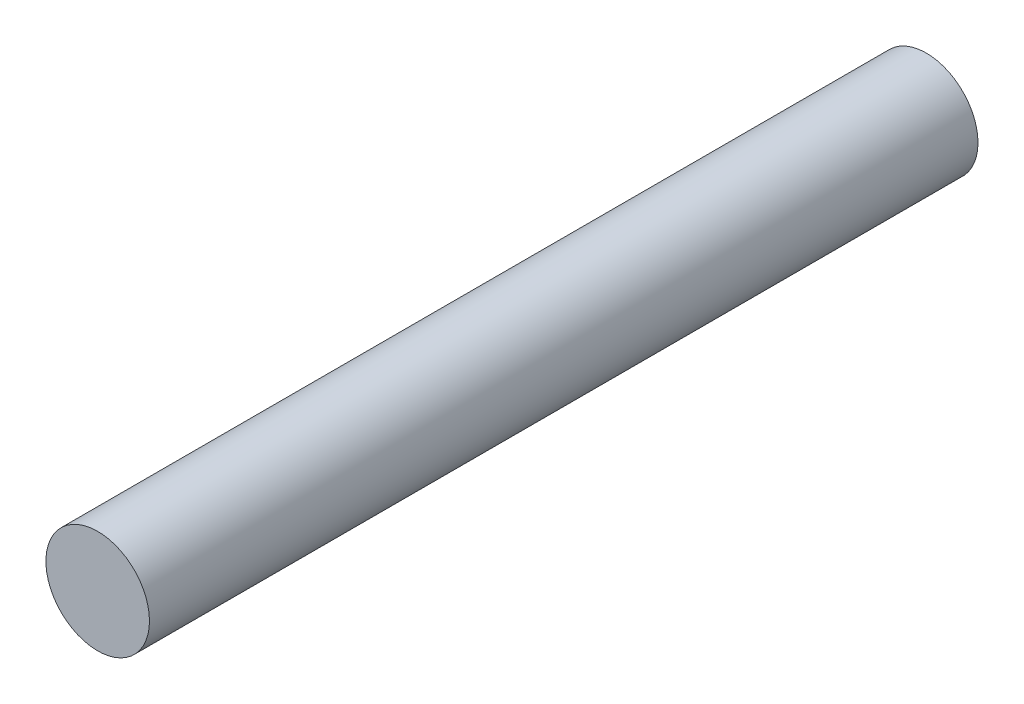
ISO-10303-21;
HEADER;
FILE_DESCRIPTION(('STEP AP214'),'2;1');
FILE_NAME('part.step','',(''),(''),'','','');
FILE_SCHEMA(('AUTOMOTIVE_DESIGN { 1 0 10303 214 1 1 1 1 }'));
ENDSEC;
DATA;
#1=APPLICATION_CONTEXT('core data for automotive mechanical design processes');
#2=APPLICATION_PROTOCOL_DEFINITION('international standard','automotive_design',2000,#1);
#3=PRODUCT_CONTEXT('',#1,'mechanical');
#4=PRODUCT('Part','Part','',(#3));
#5=PRODUCT_RELATED_PRODUCT_CATEGORY('part','',(#4));
#6=PRODUCT_DEFINITION_FORMATION('','',#4);
#7=PRODUCT_DEFINITION_CONTEXT('part definition',#1,'design');
#8=PRODUCT_DEFINITION('design','',#6,#7);
#9=PRODUCT_DEFINITION_SHAPE('','',#8);
#10=(LENGTH_UNIT() NAMED_UNIT(*) SI_UNIT(.MILLI.,.METRE.));
#11=(NAMED_UNIT(*) PLANE_ANGLE_UNIT() SI_UNIT($,.RADIAN.));
#12=(NAMED_UNIT(*) SI_UNIT($,.STERADIAN.) SOLID_ANGLE_UNIT());
#13=UNCERTAINTY_MEASURE_WITH_UNIT(LENGTH_MEASURE(1.E-05),#10,'distance_accuracy_value','');
#14=(GEOMETRIC_REPRESENTATION_CONTEXT(3) GLOBAL_UNCERTAINTY_ASSIGNED_CONTEXT((#13)) GLOBAL_UNIT_ASSIGNED_CONTEXT((#10,
#11,#12)) REPRESENTATION_CONTEXT('',''));
#15=CARTESIAN_POINT('',(0.,0.,0.));
#16=DIRECTION('',(0.,0.,1.));
#17=DIRECTION('',(1.,0.,0.));
#18=AXIS2_PLACEMENT_3D('',#15,#16,#17);
#19=CARTESIAN_POINT('',(0.,0.,31.75));
#20=DIRECTION('',(0.,0.,-1.));
#21=DIRECTION('',(-1.,0.,0.));
#22=AXIS2_PLACEMENT_3D('',#19,#20,#21);
#23=CYLINDRICAL_SURFACE('',#22,3.96875);
#24=CARTESIAN_POINT('',(0.,0.,31.75));
#25=DIRECTION('',(0.,0.,1.));
#26=DIRECTION('',(1.,0.,0.));
#27=AXIS2_PLACEMENT_3D('',#24,#25,#26);
#28=CIRCLE('',#27,3.96875);
#29=CARTESIAN_POINT('',(3.96875,0.,31.75));
#30=VERTEX_POINT('',#29);
#31=EDGE_CURVE('E10',#30,#30,#28,.T.);
#32=ORIENTED_EDGE('',*,*,#31,.F.);
#33=EDGE_LOOP('',(#32));
#34=FACE_BOUND('',#33,.T.);
#35=CARTESIAN_POINT('',(0.,0.,-31.75));
#36=DIRECTION('',(0.,0.,1.));
#37=DIRECTION('',(1.,0.,0.));
#38=AXIS2_PLACEMENT_3D('',#35,#36,#37);
#39=CIRCLE('',#38,3.96875);
#40=CARTESIAN_POINT('',(3.96875,0.,-31.75));
#41=VERTEX_POINT('',#40);
#42=EDGE_CURVE('E34',#41,#41,#39,.T.);
#43=ORIENTED_EDGE('',*,*,#42,.T.);
#44=EDGE_LOOP('',(#43));
#45=FACE_BOUND('',#44,.T.);
#46=ADVANCED_FACE('F31',(#34,#45),#23,.T.);
#47=CARTESIAN_POINT('',(0.,0.,31.75));
#48=DIRECTION('',(0.,0.,1.));
#49=DIRECTION('',(1.,0.,0.));
#50=AXIS2_PLACEMENT_3D('',#47,#48,#49);
#51=PLANE('',#50);
#52=ORIENTED_EDGE('',*,*,#31,.T.);
#53=EDGE_LOOP('',(#52));
#54=FACE_BOUND('',#53,.T.);
#55=ADVANCED_FACE('F46',(#54),#51,.T.);
#56=CARTESIAN_POINT('',(0.,0.,-31.75));
#57=DIRECTION('',(0.,0.,1.));
#58=DIRECTION('',(1.,0.,0.));
#59=AXIS2_PLACEMENT_3D('',#56,#57,#58);
#60=PLANE('',#59);
#61=ORIENTED_EDGE('',*,*,#42,.F.);
#62=EDGE_LOOP('',(#61));
#63=FACE_BOUND('',#62,.T.);
#64=ADVANCED_FACE('F44',(#63),#60,.F.);
#65=CLOSED_SHELL('',(#46,#55,#64));
#66=MANIFOLD_SOLID_BREP('B2',#65);
#67=ADVANCED_BREP_SHAPE_REPRESENTATION('',(#18,#66),#14);
#68=SHAPE_DEFINITION_REPRESENTATION(#9,#67);
ENDSEC;
END-ISO-10303-21;
